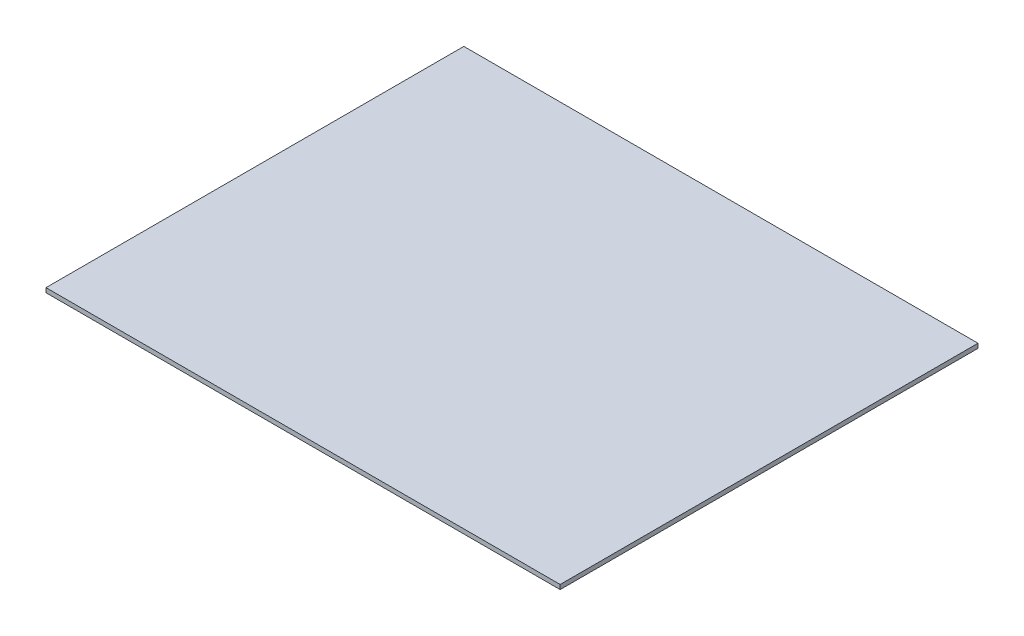
ISO-10303-21;
HEADER;
FILE_DESCRIPTION(('STEP AP214'),'2;1');
FILE_NAME('part.step','',(''),(''),'','','');
FILE_SCHEMA(('AUTOMOTIVE_DESIGN { 1 0 10303 214 1 1 1 1 }'));
ENDSEC;
DATA;
#1=APPLICATION_CONTEXT('core data for automotive mechanical design processes');
#2=APPLICATION_PROTOCOL_DEFINITION('international standard','automotive_design',2000,#1);
#3=PRODUCT_CONTEXT('',#1,'mechanical');
#4=PRODUCT('Part','Part','',(#3));
#5=PRODUCT_RELATED_PRODUCT_CATEGORY('part','',(#4));
#6=PRODUCT_DEFINITION_FORMATION('','',#4);
#7=PRODUCT_DEFINITION_CONTEXT('part definition',#1,'design');
#8=PRODUCT_DEFINITION('design','',#6,#7);
#9=PRODUCT_DEFINITION_SHAPE('','',#8);
#10=(LENGTH_UNIT() NAMED_UNIT(*) SI_UNIT(.MILLI.,.METRE.));
#11=(NAMED_UNIT(*) PLANE_ANGLE_UNIT() SI_UNIT($,.RADIAN.));
#12=(NAMED_UNIT(*) SI_UNIT($,.STERADIAN.) SOLID_ANGLE_UNIT());
#13=UNCERTAINTY_MEASURE_WITH_UNIT(LENGTH_MEASURE(1.E-05),#10,'distance_accuracy_value','');
#14=(GEOMETRIC_REPRESENTATION_CONTEXT(3) GLOBAL_UNCERTAINTY_ASSIGNED_CONTEXT((#13)) GLOBAL_UNIT_ASSIGNED_CONTEXT((#10,
#11,#12)) REPRESENTATION_CONTEXT('',''));
#15=CARTESIAN_POINT('',(0.,0.,0.));
#16=DIRECTION('',(0.,0.,1.));
#17=DIRECTION('',(1.,0.,0.));
#18=AXIS2_PLACEMENT_3D('',#15,#16,#17);
#19=CARTESIAN_POINT('',(173.5,3.,-141.));
#20=DIRECTION('',(-1.,0.,0.));
#21=DIRECTION('',(0.,0.,1.));
#22=AXIS2_PLACEMENT_3D('',#19,#20,#21);
#23=PLANE('',#22);
#24=DIRECTION('',(0.,0.,-1.));
#25=VECTOR('',#24,1.);
#26=CARTESIAN_POINT('',(173.5,0.,-141.));
#27=LINE('',#26,#25);
#28=CARTESIAN_POINT('',(173.5,0.,141.));
#29=VERTEX_POINT('',#28);
#30=CARTESIAN_POINT('',(173.5,0.,-141.));
#31=VERTEX_POINT('',#30);
#32=EDGE_CURVE('E96',#29,#31,#27,.T.);
#33=ORIENTED_EDGE('',*,*,#32,.T.);
#34=DIRECTION('',(0.,-1.,0.));
#35=VECTOR('',#34,1.);
#36=CARTESIAN_POINT('',(173.5,3.,-141.));
#37=LINE('',#36,#35);
#38=CARTESIAN_POINT('',(173.5,3.,-141.));
#39=VERTEX_POINT('',#38);
#40=EDGE_CURVE('E11',#39,#31,#37,.T.);
#41=ORIENTED_EDGE('',*,*,#40,.F.);
#42=DIRECTION('',(0.,0.,-1.));
#43=VECTOR('',#42,1.);
#44=CARTESIAN_POINT('',(173.5,3.,-141.));
#45=LINE('',#44,#43);
#46=CARTESIAN_POINT('',(173.5,3.,141.));
#47=VERTEX_POINT('',#46);
#48=EDGE_CURVE('E84',#47,#39,#45,.T.);
#49=ORIENTED_EDGE('',*,*,#48,.F.);
#50=DIRECTION('',(0.,-1.,0.));
#51=VECTOR('',#50,1.);
#52=CARTESIAN_POINT('',(173.5,3.,141.));
#53=LINE('',#52,#51);
#54=EDGE_CURVE('E92',#47,#29,#53,.T.);
#55=ORIENTED_EDGE('',*,*,#54,.T.);
#56=EDGE_LOOP('',(#33,#41,#49,#55));
#57=FACE_BOUND('',#56,.T.);
#58=ADVANCED_FACE('F33',(#57),#23,.F.);
#59=CARTESIAN_POINT('',(173.5,3.,-141.));
#60=DIRECTION('',(0.,0.,1.));
#61=DIRECTION('',(1.,0.,0.));
#62=AXIS2_PLACEMENT_3D('',#59,#60,#61);
#63=PLANE('',#62);
#64=DIRECTION('',(-1.,0.,0.));
#65=VECTOR('',#64,1.);
#66=CARTESIAN_POINT('',(173.5,0.,-141.));
#67=LINE('',#66,#65);
#68=CARTESIAN_POINT('',(-173.5,0.,-141.));
#69=VERTEX_POINT('',#68);
#70=EDGE_CURVE('E88',#31,#69,#67,.T.);
#71=ORIENTED_EDGE('',*,*,#70,.T.);
#72=DIRECTION('',(0.,-1.,0.));
#73=VECTOR('',#72,1.);
#74=CARTESIAN_POINT('',(-173.5,3.,-141.));
#75=LINE('',#74,#73);
#76=CARTESIAN_POINT('',(-173.5,3.,-141.));
#77=VERTEX_POINT('',#76);
#78=EDGE_CURVE('E41',#77,#69,#75,.T.);
#79=ORIENTED_EDGE('',*,*,#78,.F.);
#80=DIRECTION('',(-1.,0.,0.));
#81=VECTOR('',#80,1.);
#82=CARTESIAN_POINT('',(173.5,3.,-141.));
#83=LINE('',#82,#81);
#84=EDGE_CURVE('E79',#39,#77,#83,.T.);
#85=ORIENTED_EDGE('',*,*,#84,.F.);
#86=ORIENTED_EDGE('',*,*,#40,.T.);
#87=EDGE_LOOP('',(#71,#79,#85,#86));
#88=FACE_BOUND('',#87,.T.);
#89=ADVANCED_FACE('F87',(#88),#63,.F.);
#90=CARTESIAN_POINT('',(-173.5,3.,-141.));
#91=DIRECTION('',(1.,0.,0.));
#92=DIRECTION('',(0.,0.,-1.));
#93=AXIS2_PLACEMENT_3D('',#90,#91,#92);
#94=PLANE('',#93);
#95=DIRECTION('',(0.,0.,1.));
#96=VECTOR('',#95,1.);
#97=CARTESIAN_POINT('',(-173.5,0.,-141.));
#98=LINE('',#97,#96);
#99=CARTESIAN_POINT('',(-173.5,0.,141.));
#100=VERTEX_POINT('',#99);
#101=EDGE_CURVE('E66',#69,#100,#98,.T.);
#102=ORIENTED_EDGE('',*,*,#101,.T.);
#103=DIRECTION('',(0.,-1.,0.));
#104=VECTOR('',#103,1.);
#105=CARTESIAN_POINT('',(-173.5,3.,141.));
#106=LINE('',#105,#104);
#107=CARTESIAN_POINT('',(-173.5,3.,141.));
#108=VERTEX_POINT('',#107);
#109=EDGE_CURVE('E89',#108,#100,#106,.T.);
#110=ORIENTED_EDGE('',*,*,#109,.F.);
#111=DIRECTION('',(0.,0.,1.));
#112=VECTOR('',#111,1.);
#113=CARTESIAN_POINT('',(-173.5,3.,-141.));
#114=LINE('',#113,#112);
#115=EDGE_CURVE('E82',#77,#108,#114,.T.);
#116=ORIENTED_EDGE('',*,*,#115,.F.);
#117=ORIENTED_EDGE('',*,*,#78,.T.);
#118=EDGE_LOOP('',(#102,#110,#116,#117));
#119=FACE_BOUND('',#118,.T.);
#120=ADVANCED_FACE('F90',(#119),#94,.F.);
#121=CARTESIAN_POINT('',(173.5,3.,141.));
#122=DIRECTION('',(0.,0.,-1.));
#123=DIRECTION('',(-1.,0.,0.));
#124=AXIS2_PLACEMENT_3D('',#121,#122,#123);
#125=PLANE('',#124);
#126=DIRECTION('',(1.,0.,0.));
#127=VECTOR('',#126,1.);
#128=CARTESIAN_POINT('',(173.5,0.,141.));
#129=LINE('',#128,#127);
#130=EDGE_CURVE('E72',#100,#29,#129,.T.);
#131=ORIENTED_EDGE('',*,*,#130,.T.);
#132=ORIENTED_EDGE('',*,*,#54,.F.);
#133=DIRECTION('',(1.,0.,0.));
#134=VECTOR('',#133,1.);
#135=CARTESIAN_POINT('',(173.5,3.,141.));
#136=LINE('',#135,#134);
#137=EDGE_CURVE('E49',#108,#47,#136,.T.);
#138=ORIENTED_EDGE('',*,*,#137,.F.);
#139=ORIENTED_EDGE('',*,*,#109,.T.);
#140=EDGE_LOOP('',(#131,#132,#138,#139));
#141=FACE_BOUND('',#140,.T.);
#142=ADVANCED_FACE('F103',(#141),#125,.F.);
#143=CARTESIAN_POINT('',(0.,3.,0.));
#144=DIRECTION('',(0.,-1.,0.));
#145=DIRECTION('',(0.,0.,-1.));
#146=AXIS2_PLACEMENT_3D('',#143,#144,#145);
#147=PLANE('',#146);
#148=ORIENTED_EDGE('',*,*,#48,.T.);
#149=ORIENTED_EDGE('',*,*,#84,.T.);
#150=ORIENTED_EDGE('',*,*,#115,.T.);
#151=ORIENTED_EDGE('',*,*,#137,.T.);
#152=EDGE_LOOP('',(#148,#149,#150,#151));
#153=FACE_BOUND('',#152,.T.);
#154=ADVANCED_FACE('F80',(#153),#147,.F.);
#155=CARTESIAN_POINT('',(0.,0.,0.));
#156=DIRECTION('',(0.,-1.,0.));
#157=DIRECTION('',(0.,0.,-1.));
#158=AXIS2_PLACEMENT_3D('',#155,#156,#157);
#159=PLANE('',#158);
#160=ORIENTED_EDGE('',*,*,#32,.F.);
#161=ORIENTED_EDGE('',*,*,#130,.F.);
#162=ORIENTED_EDGE('',*,*,#101,.F.);
#163=ORIENTED_EDGE('',*,*,#70,.F.);
#164=EDGE_LOOP('',(#160,#161,#162,#163));
#165=FACE_BOUND('',#164,.T.);
#166=ADVANCED_FACE('F106',(#165),#159,.T.);
#167=CLOSED_SHELL('',(#58,#89,#120,#142,#154,#166));
#168=MANIFOLD_SOLID_BREP('B2',#167);
#169=ADVANCED_BREP_SHAPE_REPRESENTATION('',(#18,#168),#14);
#170=SHAPE_DEFINITION_REPRESENTATION(#9,#169);
ENDSEC;
END-ISO-10303-21;
